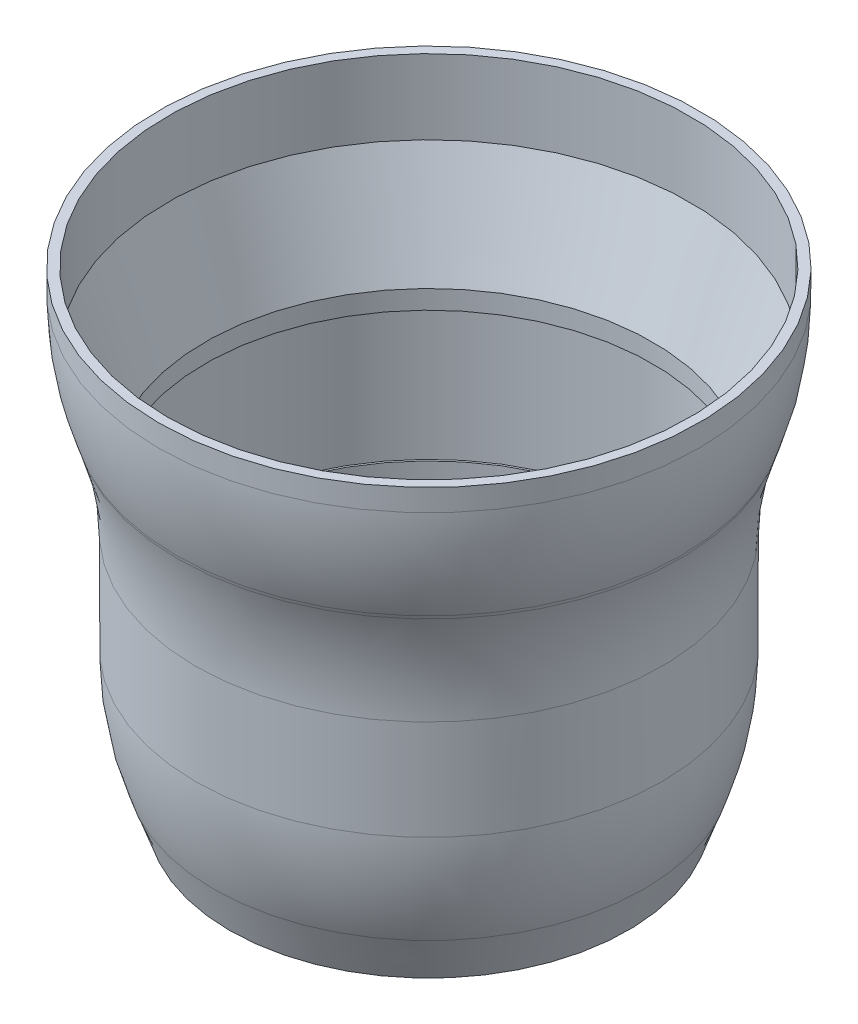
ISO-10303-21;
HEADER;
FILE_DESCRIPTION(('STEP AP214'),'2;1');
FILE_NAME('part.step','',(''),(''),'','','');
FILE_SCHEMA(('AUTOMOTIVE_DESIGN { 1 0 10303 214 1 1 1 1 }'));
ENDSEC;
DATA;
#1=APPLICATION_CONTEXT('core data for automotive mechanical design processes');
#2=APPLICATION_PROTOCOL_DEFINITION('international standard','automotive_design',2000,#1);
#3=PRODUCT_CONTEXT('',#1,'mechanical');
#4=PRODUCT('Part','Part','',(#3));
#5=PRODUCT_RELATED_PRODUCT_CATEGORY('part','',(#4));
#6=PRODUCT_DEFINITION_FORMATION('','',#4);
#7=PRODUCT_DEFINITION_CONTEXT('part definition',#1,'design');
#8=PRODUCT_DEFINITION('design','',#6,#7);
#9=PRODUCT_DEFINITION_SHAPE('','',#8);
#10=(LENGTH_UNIT() NAMED_UNIT(*) SI_UNIT(.MILLI.,.METRE.));
#11=(NAMED_UNIT(*) PLANE_ANGLE_UNIT() SI_UNIT($,.RADIAN.));
#12=(NAMED_UNIT(*) SI_UNIT($,.STERADIAN.) SOLID_ANGLE_UNIT());
#13=UNCERTAINTY_MEASURE_WITH_UNIT(LENGTH_MEASURE(1.E-05),#10,'distance_accuracy_value','');
#14=(GEOMETRIC_REPRESENTATION_CONTEXT(3) GLOBAL_UNCERTAINTY_ASSIGNED_CONTEXT((#13)) GLOBAL_UNIT_ASSIGNED_CONTEXT((#10,
#11,#12)) REPRESENTATION_CONTEXT('',''));
#15=CARTESIAN_POINT('',(0.,0.,0.));
#16=DIRECTION('',(0.,0.,1.));
#17=DIRECTION('',(1.,0.,0.));
#18=AXIS2_PLACEMENT_3D('',#15,#16,#17);
#19=CARTESIAN_POINT('',(0.,54.9128607885692,-120.));
#20=DIRECTION('',(0.,1.,0.));
#21=DIRECTION('',(0.,0.,1.));
#22=AXIS2_PLACEMENT_3D('',#19,#20,#21);
#23=PLANE('',#22);
#24=CARTESIAN_POINT('',(0.,54.9128607885692,0.));
#25=DIRECTION('',(0.,1.,0.));
#26=DIRECTION('',(0.,0.,1.));
#27=AXIS2_PLACEMENT_3D('',#24,#25,#26);
#28=CIRCLE('',#27,121.);
#29=CARTESIAN_POINT('',(0.,54.9128607885692,121.));
#30=VERTEX_POINT('',#29);
#31=EDGE_CURVE('E102',#30,#30,#28,.T.);
#32=ORIENTED_EDGE('',*,*,#31,.F.);
#33=EDGE_LOOP('',(#32));
#34=FACE_BOUND('',#33,.T.);
#35=CARTESIAN_POINT('',(0.,54.9128607885692,0.));
#36=DIRECTION('',(0.,1.,0.));
#37=DIRECTION('',(0.,0.,1.));
#38=AXIS2_PLACEMENT_3D('',#35,#36,#37);
#39=CIRCLE('',#38,120.);
#40=CARTESIAN_POINT('',(0.,54.9128607885692,120.));
#41=VERTEX_POINT('',#40);
#42=EDGE_CURVE('E72',#41,#41,#39,.T.);
#43=ORIENTED_EDGE('',*,*,#42,.T.);
#44=EDGE_LOOP('',(#43));
#45=FACE_BOUND('',#44,.T.);
#46=ADVANCED_FACE('F46',(#34,#45),#23,.F.);
#47=CARTESIAN_POINT('',(0.,159.946981614936,0.));
#48=DIRECTION('',(0.,1.,0.));
#49=DIRECTION('',(0.,0.,1.));
#50=AXIS2_PLACEMENT_3D('',#47,#48,#49);
#51=CYLINDRICAL_SURFACE('',#50,120.);
#52=ORIENTED_EDGE('',*,*,#42,.F.);
#53=EDGE_LOOP('',(#52));
#54=FACE_BOUND('',#53,.T.);
#55=CARTESIAN_POINT('',(0.,64.997433225844,0.));
#56=DIRECTION('',(0.,1.,0.));
#57=DIRECTION('',(0.,0.,1.));
#58=AXIS2_PLACEMENT_3D('',#55,#56,#57);
#59=CIRCLE('',#58,120.);
#60=CARTESIAN_POINT('',(0.,64.997433225844,120.));
#61=VERTEX_POINT('',#60);
#62=EDGE_CURVE('E75',#61,#61,#59,.T.);
#63=ORIENTED_EDGE('',*,*,#62,.T.);
#64=EDGE_LOOP('',(#63));
#65=FACE_BOUND('',#64,.T.);
#66=ADVANCED_FACE('F110',(#54,#65),#51,.F.);
#67=CARTESIAN_POINT('',(0.,119.946981614936,0.));
#68=DIRECTION('',(0.,1.,0.));
#69=DIRECTION('',(0.,0.,1.));
#70=AXIS2_PLACEMENT_3D('',#67,#68,#69);
#71=CONICAL_SURFACE('',#70,140.,0.349065850398868);
#72=ORIENTED_EDGE('',*,*,#62,.F.);
#73=EDGE_LOOP('',(#72));
#74=FACE_BOUND('',#73,.T.);
#75=CARTESIAN_POINT('',(0.,119.946981614936,0.));
#76=DIRECTION('',(0.,1.,0.));
#77=DIRECTION('',(0.,0.,1.));
#78=AXIS2_PLACEMENT_3D('',#75,#76,#77);
#79=CIRCLE('',#78,140.);
#80=CARTESIAN_POINT('',(0.,119.946981614936,140.));
#81=VERTEX_POINT('',#80);
#82=EDGE_CURVE('E78',#81,#81,#79,.T.);
#83=ORIENTED_EDGE('',*,*,#82,.T.);
#84=EDGE_LOOP('',(#83));
#85=FACE_BOUND('',#84,.T.);
#86=ADVANCED_FACE('F116',(#74,#85),#71,.F.);
#87=CARTESIAN_POINT('',(0.,159.946981614936,0.));
#88=DIRECTION('',(0.,1.,0.));
#89=DIRECTION('',(0.,0.,1.));
#90=AXIS2_PLACEMENT_3D('',#87,#88,#89);
#91=CYLINDRICAL_SURFACE('',#90,140.);
#92=ORIENTED_EDGE('',*,*,#82,.F.);
#93=EDGE_LOOP('',(#92));
#94=FACE_BOUND('',#93,.T.);
#95=CARTESIAN_POINT('',(0.,159.946981614936,0.));
#96=DIRECTION('',(0.,1.,0.));
#97=DIRECTION('',(0.,0.,1.));
#98=AXIS2_PLACEMENT_3D('',#95,#96,#97);
#99=CIRCLE('',#98,140.);
#100=CARTESIAN_POINT('',(0.,159.946981614936,140.));
#101=VERTEX_POINT('',#100);
#102=EDGE_CURVE('E81',#101,#101,#99,.T.);
#103=ORIENTED_EDGE('',*,*,#102,.T.);
#104=EDGE_LOOP('',(#103));
#105=FACE_BOUND('',#104,.T.);
#106=ADVANCED_FACE('F122',(#94,#105),#91,.F.);
#107=CARTESIAN_POINT('',(0.,159.946981614936,-140.));
#108=DIRECTION('',(0.,-1.,0.));
#109=DIRECTION('',(0.,0.,-1.));
#110=AXIS2_PLACEMENT_3D('',#107,#108,#109);
#111=PLANE('',#110);
#112=ORIENTED_EDGE('',*,*,#102,.F.);
#113=EDGE_LOOP('',(#112));
#114=FACE_BOUND('',#113,.T.);
#115=CARTESIAN_POINT('',(0.,159.946981614936,0.));
#116=DIRECTION('',(0.,1.,0.));
#117=DIRECTION('',(0.,0.,1.));
#118=AXIS2_PLACEMENT_3D('',#115,#116,#117);
#119=CIRCLE('',#118,145.);
#120=CARTESIAN_POINT('',(0.,159.946981614936,145.));
#121=VERTEX_POINT('',#120);
#122=EDGE_CURVE('E84',#121,#121,#119,.T.);
#123=ORIENTED_EDGE('',*,*,#122,.T.);
#124=EDGE_LOOP('',(#123));
#125=FACE_BOUND('',#124,.T.);
#126=ADVANCED_FACE('F128',(#114,#125),#111,.F.);
#127=CARTESIAN_POINT('',(0.,159.946981614936,0.));
#128=DIRECTION('',(0.,1.,0.));
#129=DIRECTION('',(0.,0.,1.));
#130=AXIS2_PLACEMENT_3D('',#127,#128,#129);
#131=CYLINDRICAL_SURFACE('',#130,145.);
#132=CARTESIAN_POINT('',(0.,148.159298528291,0.));
#133=DIRECTION('',(0.,-1.,0.));
#134=DIRECTION('',(0.,0.,-1.));
#135=AXIS2_PLACEMENT_3D('',#132,#133,#134);
#136=CIRCLE('',#135,145.);
#137=CARTESIAN_POINT('',(0.,148.159298528291,-145.));
#138=VERTEX_POINT('',#137);
#139=EDGE_CURVE('E12',#138,#138,#136,.F.);
#140=ORIENTED_EDGE('',*,*,#139,.T.);
#141=EDGE_LOOP('',(#140));
#142=FACE_BOUND('',#141,.T.);
#143=ORIENTED_EDGE('',*,*,#122,.F.);
#144=EDGE_LOOP('',(#143));
#145=FACE_BOUND('',#144,.T.);
#146=ADVANCED_FACE('F134',(#142,#145),#131,.T.);
#147=CARTESIAN_POINT('',(0.,64.997433225844,0.));
#148=DIRECTION('',(0.,1.,0.));
#149=DIRECTION('',(0.,0.,1.));
#150=AXIS2_PLACEMENT_3D('',#147,#148,#149);
#151=CONICAL_SURFACE('',#150,125.,0.349065850398868);
#152=CARTESIAN_POINT('',(0.,91.508339244597,0.));
#153=DIRECTION('',(0.,1.,0.));
#154=DIRECTION('',(0.,0.,1.));
#155=AXIS2_PLACEMENT_3D('',#152,#153,#154);
#156=CIRCLE('',#155,134.649180674255);
#157=CARTESIAN_POINT('',(0.,91.508339244597,134.649180674255));
#158=VERTEX_POINT('',#157);
#159=EDGE_CURVE('E53',#158,#158,#156,.T.);
#160=ORIENTED_EDGE('',*,*,#159,.T.);
#161=EDGE_LOOP('',(#160));
#162=FACE_BOUND('',#161,.T.);
#163=CARTESIAN_POINT('',(0.,93.4360755961836,0.));
#164=DIRECTION('',(0.,-1.,0.));
#165=DIRECTION('',(0.,0.,-1.));
#166=AXIS2_PLACEMENT_3D('',#163,#164,#165);
#167=CIRCLE('',#166,135.350819325745);
#168=CARTESIAN_POINT('',(0.,93.4360755961836,-135.350819325745));
#169=VERTEX_POINT('',#168);
#170=EDGE_CURVE('E57',#169,#169,#167,.T.);
#171=ORIENTED_EDGE('',*,*,#170,.T.);
#172=EDGE_LOOP('',(#171));
#173=FACE_BOUND('',#172,.T.);
#174=ADVANCED_FACE('F139',(#162,#173),#151,.T.);
#175=CARTESIAN_POINT('',(0.,159.946981614936,0.));
#176=DIRECTION('',(0.,1.,0.));
#177=DIRECTION('',(0.,0.,1.));
#178=AXIS2_PLACEMENT_3D('',#175,#176,#177);
#179=CYLINDRICAL_SURFACE('',#178,125.);
#180=CARTESIAN_POINT('',(0.,-16.7902498608016,0.));
#181=DIRECTION('',(0.,-1.,0.));
#182=DIRECTION('',(0.,0.,-1.));
#183=AXIS2_PLACEMENT_3D('',#180,#181,#182);
#184=CIRCLE('',#183,125.);
#185=CARTESIAN_POINT('',(0.,-16.7902498608016,-125.));
#186=VERTEX_POINT('',#185);
#187=EDGE_CURVE('E66',#186,#186,#184,.F.);
#188=ORIENTED_EDGE('',*,*,#187,.T.);
#189=EDGE_LOOP('',(#188));
#190=FACE_BOUND('',#189,.T.);
#191=CARTESIAN_POINT('',(0.,36.7851163124896,0.));
#192=DIRECTION('',(0.,1.,0.));
#193=DIRECTION('',(0.,0.,1.));
#194=AXIS2_PLACEMENT_3D('',#191,#192,#193);
#195=CIRCLE('',#194,125.);
#196=CARTESIAN_POINT('',(0.,36.7851163124896,125.));
#197=VERTEX_POINT('',#196);
#198=EDGE_CURVE('E69',#197,#197,#195,.F.);
#199=ORIENTED_EDGE('',*,*,#198,.T.);
#200=EDGE_LOOP('',(#199));
#201=FACE_BOUND('',#200,.T.);
#202=ADVANCED_FACE('F144',(#190,#201),#179,.T.);
#203=CARTESIAN_POINT('',(0.,-95.002566774156,0.));
#204=DIRECTION('',(0.,1.,0.));
#205=DIRECTION('',(0.,0.,1.));
#206=AXIS2_PLACEMENT_3D('',#203,#204,#205);
#207=CONICAL_SURFACE('',#206,106.80148828669,0.349065850398867);
#208=CARTESIAN_POINT('',(0.,-71.5134727929088,0.));
#209=DIRECTION('',(0.,-1.,0.));
#210=DIRECTION('',(0.,0.,-1.));
#211=AXIS2_PLACEMENT_3D('',#208,#209,#210);
#212=CIRCLE('',#211,115.350819325745);
#213=CARTESIAN_POINT('',(0.,-71.5134727929088,-115.350819325745));
#214=VERTEX_POINT('',#213);
#215=EDGE_CURVE('E61',#214,#214,#212,.T.);
#216=ORIENTED_EDGE('',*,*,#215,.T.);
#217=EDGE_LOOP('',(#216));
#218=FACE_BOUND('',#217,.T.);
#219=CARTESIAN_POINT('',(0.,-95.002566774156,0.));
#220=DIRECTION('',(0.,1.,0.));
#221=DIRECTION('',(0.,0.,1.));
#222=AXIS2_PLACEMENT_3D('',#219,#220,#221);
#223=CIRCLE('',#222,106.80148828669);
#224=CARTESIAN_POINT('',(0.,-95.002566774156,106.80148828669));
#225=VERTEX_POINT('',#224);
#226=EDGE_CURVE('E87',#225,#225,#223,.T.);
#227=ORIENTED_EDGE('',*,*,#226,.T.);
#228=EDGE_LOOP('',(#227));
#229=FACE_BOUND('',#228,.T.);
#230=ADVANCED_FACE('F162',(#218,#229),#207,.T.);
#231=CARTESIAN_POINT('',(0.,-95.002566774156,-106.80148828669));
#232=DIRECTION('',(0.,1.,0.));
#233=DIRECTION('',(0.,0.,1.));
#234=AXIS2_PLACEMENT_3D('',#231,#232,#233);
#235=PLANE('',#234);
#236=ORIENTED_EDGE('',*,*,#226,.F.);
#237=EDGE_LOOP('',(#236));
#238=FACE_BOUND('',#237,.T.);
#239=CARTESIAN_POINT('',(0.,-95.002566774156,0.));
#240=DIRECTION('',(0.,1.,0.));
#241=DIRECTION('',(0.,0.,1.));
#242=AXIS2_PLACEMENT_3D('',#239,#240,#241);
#243=CIRCLE('',#242,101.80148828669);
#244=CARTESIAN_POINT('',(0.,-95.002566774156,101.80148828669));
#245=VERTEX_POINT('',#244);
#246=EDGE_CURVE('E90',#245,#245,#243,.T.);
#247=ORIENTED_EDGE('',*,*,#246,.T.);
#248=EDGE_LOOP('',(#247));
#249=FACE_BOUND('',#248,.T.);
#250=ADVANCED_FACE('F167',(#238,#249),#235,.F.);
#251=CARTESIAN_POINT('',(0.,-45.002566774156,0.));
#252=DIRECTION('',(0.,1.,0.));
#253=DIRECTION('',(0.,0.,1.));
#254=AXIS2_PLACEMENT_3D('',#251,#252,#253);
#255=CONICAL_SURFACE('',#254,120.,0.349065850398868);
#256=ORIENTED_EDGE('',*,*,#246,.F.);
#257=EDGE_LOOP('',(#256));
#258=FACE_BOUND('',#257,.T.);
#259=CARTESIAN_POINT('',(0.,-45.002566774156,0.));
#260=DIRECTION('',(0.,1.,0.));
#261=DIRECTION('',(0.,0.,1.));
#262=AXIS2_PLACEMENT_3D('',#259,#260,#261);
#263=CIRCLE('',#262,120.);
#264=CARTESIAN_POINT('',(0.,-45.002566774156,120.));
#265=VERTEX_POINT('',#264);
#266=EDGE_CURVE('E93',#265,#265,#263,.T.);
#267=ORIENTED_EDGE('',*,*,#266,.T.);
#268=EDGE_LOOP('',(#267));
#269=FACE_BOUND('',#268,.T.);
#270=ADVANCED_FACE('F173',(#258,#269),#255,.F.);
#271=CARTESIAN_POINT('',(0.,159.946981614936,0.));
#272=DIRECTION('',(0.,1.,0.));
#273=DIRECTION('',(0.,0.,1.));
#274=AXIS2_PLACEMENT_3D('',#271,#272,#273);
#275=CYLINDRICAL_SURFACE('',#274,120.);
#276=ORIENTED_EDGE('',*,*,#266,.F.);
#277=EDGE_LOOP('',(#276));
#278=FACE_BOUND('',#277,.T.);
#279=CARTESIAN_POINT('',(0.,-15.0871392114308,0.));
#280=DIRECTION('',(0.,1.,0.));
#281=DIRECTION('',(0.,0.,1.));
#282=AXIS2_PLACEMENT_3D('',#279,#280,#281);
#283=CIRCLE('',#282,120.);
#284=CARTESIAN_POINT('',(0.,-15.0871392114308,120.));
#285=VERTEX_POINT('',#284);
#286=EDGE_CURVE('E96',#285,#285,#283,.T.);
#287=ORIENTED_EDGE('',*,*,#286,.T.);
#288=EDGE_LOOP('',(#287));
#289=FACE_BOUND('',#288,.T.);
#290=ADVANCED_FACE('F177',(#278,#289),#275,.F.);
#291=CARTESIAN_POINT('',(0.,-15.0871392114309,-120.));
#292=DIRECTION('',(0.,-1.,0.));
#293=DIRECTION('',(0.,0.,-1.));
#294=AXIS2_PLACEMENT_3D('',#291,#292,#293);
#295=PLANE('',#294);
#296=ORIENTED_EDGE('',*,*,#286,.F.);
#297=EDGE_LOOP('',(#296));
#298=FACE_BOUND('',#297,.T.);
#299=CARTESIAN_POINT('',(0.,-15.0871392114308,0.));
#300=DIRECTION('',(0.,1.,0.));
#301=DIRECTION('',(0.,0.,1.));
#302=AXIS2_PLACEMENT_3D('',#299,#300,#301);
#303=CIRCLE('',#302,121.);
#304=CARTESIAN_POINT('',(0.,-15.0871392114308,121.));
#305=VERTEX_POINT('',#304);
#306=EDGE_CURVE('E99',#305,#305,#303,.T.);
#307=ORIENTED_EDGE('',*,*,#306,.T.);
#308=EDGE_LOOP('',(#307));
#309=FACE_BOUND('',#308,.T.);
#310=ADVANCED_FACE('F181',(#298,#309),#295,.F.);
#311=CARTESIAN_POINT('',(0.,159.946981614936,0.));
#312=DIRECTION('',(0.,1.,0.));
#313=DIRECTION('',(0.,0.,1.));
#314=AXIS2_PLACEMENT_3D('',#311,#312,#313);
#315=CYLINDRICAL_SURFACE('',#314,121.);
#316=ORIENTED_EDGE('',*,*,#306,.F.);
#317=EDGE_LOOP('',(#316));
#318=FACE_BOUND('',#317,.T.);
#319=ORIENTED_EDGE('',*,*,#31,.T.);
#320=EDGE_LOOP('',(#319));
#321=FACE_BOUND('',#320,.T.);
#322=ADVANCED_FACE('F106',(#318,#321),#315,.F.);
#323=CARTESIAN_POINT('',(0.,-16.7902498608016,0.));
#324=DIRECTION('',(0.,-1.,0.));
#325=DIRECTION('',(0.,0.,-1.));
#326=AXIS2_PLACEMENT_3D('',#323,#324,#325);
#327=DEGENERATE_TOROIDAL_SURFACE('',#326,35.,160.,.F.);
#328=ORIENTED_EDGE('',*,*,#215,.F.);
#329=EDGE_LOOP('',(#328));
#330=FACE_BOUND('',#329,.T.);
#331=ORIENTED_EDGE('',*,*,#187,.F.);
#332=EDGE_LOOP('',(#331));
#333=FACE_BOUND('',#332,.T.);
#334=ADVANCED_FACE('F148',(#330,#333),#327,.F.);
#335=CARTESIAN_POINT('',(0.,36.7851163124896,0.));
#336=DIRECTION('',(0.,1.,0.));
#337=DIRECTION('',(0.,0.,1.));
#338=AXIS2_PLACEMENT_3D('',#335,#336,#337);
#339=TOROIDAL_SURFACE('',#338,285.,160.);
#340=ORIENTED_EDGE('',*,*,#198,.F.);
#341=EDGE_LOOP('',(#340));
#342=FACE_BOUND('',#341,.T.);
#343=ORIENTED_EDGE('',*,*,#159,.F.);
#344=EDGE_LOOP('',(#343));
#345=FACE_BOUND('',#344,.T.);
#346=ADVANCED_FACE('F150',(#342,#345),#339,.F.);
#347=CARTESIAN_POINT('',(0.,148.159298528291,0.));
#348=DIRECTION('',(0.,-1.,0.));
#349=DIRECTION('',(0.,0.,-1.));
#350=AXIS2_PLACEMENT_3D('',#347,#348,#349);
#351=DEGENERATE_TOROIDAL_SURFACE('',#350,14.9999999999999,160.,.F.);
#352=ORIENTED_EDGE('',*,*,#170,.F.);
#353=EDGE_LOOP('',(#352));
#354=FACE_BOUND('',#353,.T.);
#355=ORIENTED_EDGE('',*,*,#139,.F.);
#356=EDGE_LOOP('',(#355));
#357=FACE_BOUND('',#356,.T.);
#358=ADVANCED_FACE('F48',(#354,#357),#351,.F.);
#359=CLOSED_SHELL('',(#46,#66,#86,#106,#126,#146,#174,#202,#230,#250,#270,#290,#310,#322,#334,
#346,#358));
#360=MANIFOLD_SOLID_BREP('B2',#359);
#361=ADVANCED_BREP_SHAPE_REPRESENTATION('',(#18,#360),#14);
#362=SHAPE_DEFINITION_REPRESENTATION(#9,#361);
ENDSEC;
END-ISO-10303-21;
